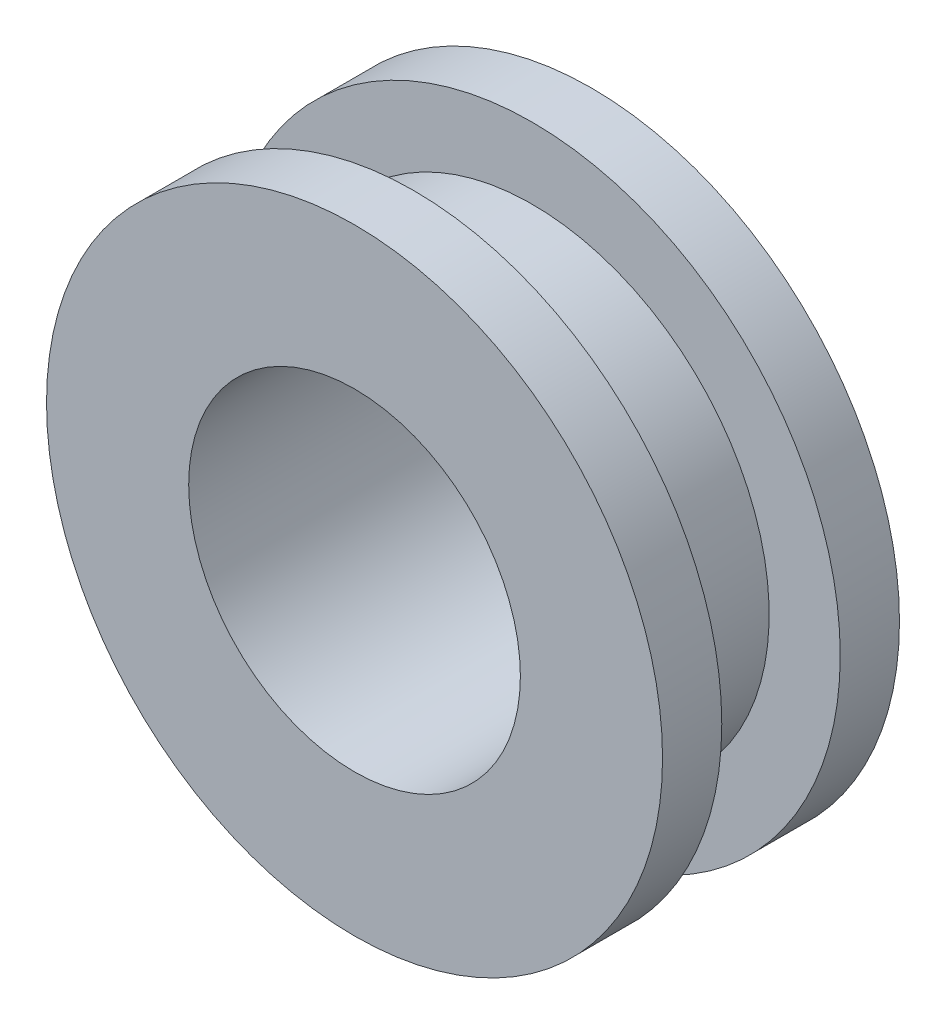
ISO-10303-21;
HEADER;
FILE_DESCRIPTION(('STEP AP214'),'2;1');
FILE_NAME('part.step','',(''),(''),'','','');
FILE_SCHEMA(('AUTOMOTIVE_DESIGN { 1 0 10303 214 1 1 1 1 }'));
ENDSEC;
DATA;
#1=APPLICATION_CONTEXT('core data for automotive mechanical design processes');
#2=APPLICATION_PROTOCOL_DEFINITION('international standard','automotive_design',2000,#1);
#3=PRODUCT_CONTEXT('',#1,'mechanical');
#4=PRODUCT('Part','Part','',(#3));
#5=PRODUCT_RELATED_PRODUCT_CATEGORY('part','',(#4));
#6=PRODUCT_DEFINITION_FORMATION('','',#4);
#7=PRODUCT_DEFINITION_CONTEXT('part definition',#1,'design');
#8=PRODUCT_DEFINITION('design','',#6,#7);
#9=PRODUCT_DEFINITION_SHAPE('','',#8);
#10=(LENGTH_UNIT() NAMED_UNIT(*) SI_UNIT(.MILLI.,.METRE.));
#11=(NAMED_UNIT(*) PLANE_ANGLE_UNIT() SI_UNIT($,.RADIAN.));
#12=(NAMED_UNIT(*) SI_UNIT($,.STERADIAN.) SOLID_ANGLE_UNIT());
#13=UNCERTAINTY_MEASURE_WITH_UNIT(LENGTH_MEASURE(1.E-05),#10,'distance_accuracy_value','');
#14=(GEOMETRIC_REPRESENTATION_CONTEXT(3) GLOBAL_UNCERTAINTY_ASSIGNED_CONTEXT((#13)) GLOBAL_UNIT_ASSIGNED_CONTEXT((#10,
#11,#12)) REPRESENTATION_CONTEXT('',''));
#15=CARTESIAN_POINT('',(0.,0.,0.));
#16=DIRECTION('',(0.,0.,1.));
#17=DIRECTION('',(1.,0.,0.));
#18=AXIS2_PLACEMENT_3D('',#15,#16,#17);
#19=CARTESIAN_POINT('',(0.,0.,5.));
#20=DIRECTION('',(0.,0.,-1.));
#21=DIRECTION('',(-1.,0.,0.));
#22=AXIS2_PLACEMENT_3D('',#19,#20,#21);
#23=CYLINDRICAL_SURFACE('',#22,6.5);
#24=CARTESIAN_POINT('',(0.,0.,5.));
#25=DIRECTION('',(0.,0.,1.));
#26=DIRECTION('',(1.,0.,0.));
#27=AXIS2_PLACEMENT_3D('',#24,#25,#26);
#28=CIRCLE('',#27,6.5);
#29=CARTESIAN_POINT('',(6.5,0.,5.));
#30=VERTEX_POINT('',#29);
#31=EDGE_CURVE('E10',#30,#30,#28,.T.);
#32=ORIENTED_EDGE('',*,*,#31,.F.);
#33=EDGE_LOOP('',(#32));
#34=FACE_BOUND('',#33,.T.);
#35=CARTESIAN_POINT('',(0.,0.,3.75));
#36=DIRECTION('',(0.,0.,-1.));
#37=DIRECTION('',(-1.,0.,0.));
#38=AXIS2_PLACEMENT_3D('',#35,#36,#37);
#39=CIRCLE('',#38,6.5);
#40=CARTESIAN_POINT('',(-6.5,0.,3.75));
#41=VERTEX_POINT('',#40);
#42=EDGE_CURVE('E71',#41,#41,#39,.T.);
#43=ORIENTED_EDGE('',*,*,#42,.F.);
#44=EDGE_LOOP('',(#43));
#45=FACE_BOUND('',#44,.T.);
#46=ADVANCED_FACE('F37',(#34,#45),#23,.T.);
#47=CARTESIAN_POINT('',(0.,0.,5.));
#48=DIRECTION('',(0.,0.,1.));
#49=DIRECTION('',(1.,0.,0.));
#50=AXIS2_PLACEMENT_3D('',#47,#48,#49);
#51=PLANE('',#50);
#52=ORIENTED_EDGE('',*,*,#31,.T.);
#53=EDGE_LOOP('',(#52));
#54=FACE_BOUND('',#53,.T.);
#55=CARTESIAN_POINT('',(0.,0.,5.));
#56=DIRECTION('',(0.,0.,1.));
#57=DIRECTION('',(1.,0.,0.));
#58=AXIS2_PLACEMENT_3D('',#55,#56,#57);
#59=CIRCLE('',#58,3.5);
#60=CARTESIAN_POINT('',(3.5,0.,5.));
#61=VERTEX_POINT('',#60);
#62=EDGE_CURVE('E50',#61,#61,#59,.T.);
#63=ORIENTED_EDGE('',*,*,#62,.F.);
#64=EDGE_LOOP('',(#63));
#65=FACE_BOUND('',#64,.T.);
#66=ADVANCED_FACE('F80',(#54,#65),#51,.T.);
#67=CARTESIAN_POINT('',(0.,0.,0.));
#68=DIRECTION('',(0.,0.,1.));
#69=DIRECTION('',(1.,0.,0.));
#70=AXIS2_PLACEMENT_3D('',#67,#68,#69);
#71=PLANE('',#70);
#72=CARTESIAN_POINT('',(0.,0.,0.));
#73=DIRECTION('',(0.,0.,1.));
#74=DIRECTION('',(1.,0.,0.));
#75=AXIS2_PLACEMENT_3D('',#72,#73,#74);
#76=CIRCLE('',#75,6.5);
#77=CARTESIAN_POINT('',(6.5,0.,0.));
#78=VERTEX_POINT('',#77);
#79=EDGE_CURVE('E41',#78,#78,#76,.T.);
#80=ORIENTED_EDGE('',*,*,#79,.F.);
#81=EDGE_LOOP('',(#80));
#82=FACE_BOUND('',#81,.T.);
#83=CARTESIAN_POINT('',(0.,0.,0.));
#84=DIRECTION('',(0.,0.,1.));
#85=DIRECTION('',(1.,0.,0.));
#86=AXIS2_PLACEMENT_3D('',#83,#84,#85);
#87=CIRCLE('',#86,3.5);
#88=CARTESIAN_POINT('',(3.5,0.,0.));
#89=VERTEX_POINT('',#88);
#90=EDGE_CURVE('E52',#89,#89,#87,.T.);
#91=ORIENTED_EDGE('',*,*,#90,.T.);
#92=EDGE_LOOP('',(#91));
#93=FACE_BOUND('',#92,.T.);
#94=ADVANCED_FACE('F85',(#82,#93),#71,.F.);
#95=CARTESIAN_POINT('',(0.,0.,1.25));
#96=DIRECTION('',(0.,0.,-1.));
#97=DIRECTION('',(-1.,0.,0.));
#98=AXIS2_PLACEMENT_3D('',#95,#96,#97);
#99=CIRCLE('',#98,6.5);
#100=CARTESIAN_POINT('',(-6.5,0.,1.25));
#101=VERTEX_POINT('',#100);
#102=EDGE_CURVE('E67',#101,#101,#99,.T.);
#103=ORIENTED_EDGE('',*,*,#102,.T.);
#104=EDGE_LOOP('',(#103));
#105=FACE_BOUND('',#104,.T.);
#106=ORIENTED_EDGE('',*,*,#79,.T.);
#107=EDGE_LOOP('',(#106));
#108=FACE_BOUND('',#107,.T.);
#109=ADVANCED_FACE('F39',(#105,#108),#23,.T.);
#110=CARTESIAN_POINT('',(0.,0.,5.));
#111=DIRECTION('',(0.,0.,-1.));
#112=DIRECTION('',(-1.,0.,0.));
#113=AXIS2_PLACEMENT_3D('',#110,#111,#112);
#114=CYLINDRICAL_SURFACE('',#113,3.5);
#115=ORIENTED_EDGE('',*,*,#62,.T.);
#116=EDGE_LOOP('',(#115));
#117=FACE_BOUND('',#116,.T.);
#118=ORIENTED_EDGE('',*,*,#90,.F.);
#119=EDGE_LOOP('',(#118));
#120=FACE_BOUND('',#119,.T.);
#121=ADVANCED_FACE('F88',(#117,#120),#114,.F.);
#122=CARTESIAN_POINT('',(5.,0.,3.75));
#123=DIRECTION('',(0.,0.,-1.));
#124=DIRECTION('',(-1.,0.,0.));
#125=AXIS2_PLACEMENT_3D('',#122,#123,#124);
#126=PLANE('',#125);
#127=ORIENTED_EDGE('',*,*,#42,.T.);
#128=EDGE_LOOP('',(#127));
#129=FACE_BOUND('',#128,.T.);
#130=CARTESIAN_POINT('',(0.,0.,3.75));
#131=DIRECTION('',(0.,0.,-1.));
#132=DIRECTION('',(-1.,0.,0.));
#133=AXIS2_PLACEMENT_3D('',#130,#131,#132);
#134=CIRCLE('',#133,5.);
#135=CARTESIAN_POINT('',(-5.,0.,3.75));
#136=VERTEX_POINT('',#135);
#137=EDGE_CURVE('E56',#136,#136,#134,.T.);
#138=ORIENTED_EDGE('',*,*,#137,.F.);
#139=EDGE_LOOP('',(#138));
#140=FACE_BOUND('',#139,.T.);
#141=ADVANCED_FACE('F76',(#129,#140),#126,.T.);
#142=CARTESIAN_POINT('',(0.,0.,-1.62435199267363));
#143=DIRECTION('',(0.,0.,-1.));
#144=DIRECTION('',(-1.,0.,0.));
#145=AXIS2_PLACEMENT_3D('',#142,#143,#144);
#146=CYLINDRICAL_SURFACE('',#145,5.);
#147=ORIENTED_EDGE('',*,*,#137,.T.);
#148=EDGE_LOOP('',(#147));
#149=FACE_BOUND('',#148,.T.);
#150=CARTESIAN_POINT('',(0.,0.,1.25));
#151=DIRECTION('',(0.,0.,-1.));
#152=DIRECTION('',(-1.,0.,0.));
#153=AXIS2_PLACEMENT_3D('',#150,#151,#152);
#154=CIRCLE('',#153,5.);
#155=CARTESIAN_POINT('',(-5.,0.,1.25));
#156=VERTEX_POINT('',#155);
#157=EDGE_CURVE('E63',#156,#156,#154,.T.);
#158=ORIENTED_EDGE('',*,*,#157,.F.);
#159=EDGE_LOOP('',(#158));
#160=FACE_BOUND('',#159,.T.);
#161=ADVANCED_FACE('F107',(#149,#160),#146,.T.);
#162=CARTESIAN_POINT('',(5.,0.,1.25));
#163=DIRECTION('',(0.,0.,-1.));
#164=DIRECTION('',(-1.,0.,0.));
#165=AXIS2_PLACEMENT_3D('',#162,#163,#164);
#166=PLANE('',#165);
#167=ORIENTED_EDGE('',*,*,#102,.F.);
#168=EDGE_LOOP('',(#167));
#169=FACE_BOUND('',#168,.T.);
#170=ORIENTED_EDGE('',*,*,#157,.T.);
#171=EDGE_LOOP('',(#170));
#172=FACE_BOUND('',#171,.T.);
#173=ADVANCED_FACE('F104',(#169,#172),#166,.F.);
#174=CLOSED_SHELL('',(#46,#66,#94,#109,#121,#141,#161,#173));
#175=MANIFOLD_SOLID_BREP('B2',#174);
#176=ADVANCED_BREP_SHAPE_REPRESENTATION('',(#18,#175),#14);
#177=SHAPE_DEFINITION_REPRESENTATION(#9,#176);
ENDSEC;
END-ISO-10303-21;
